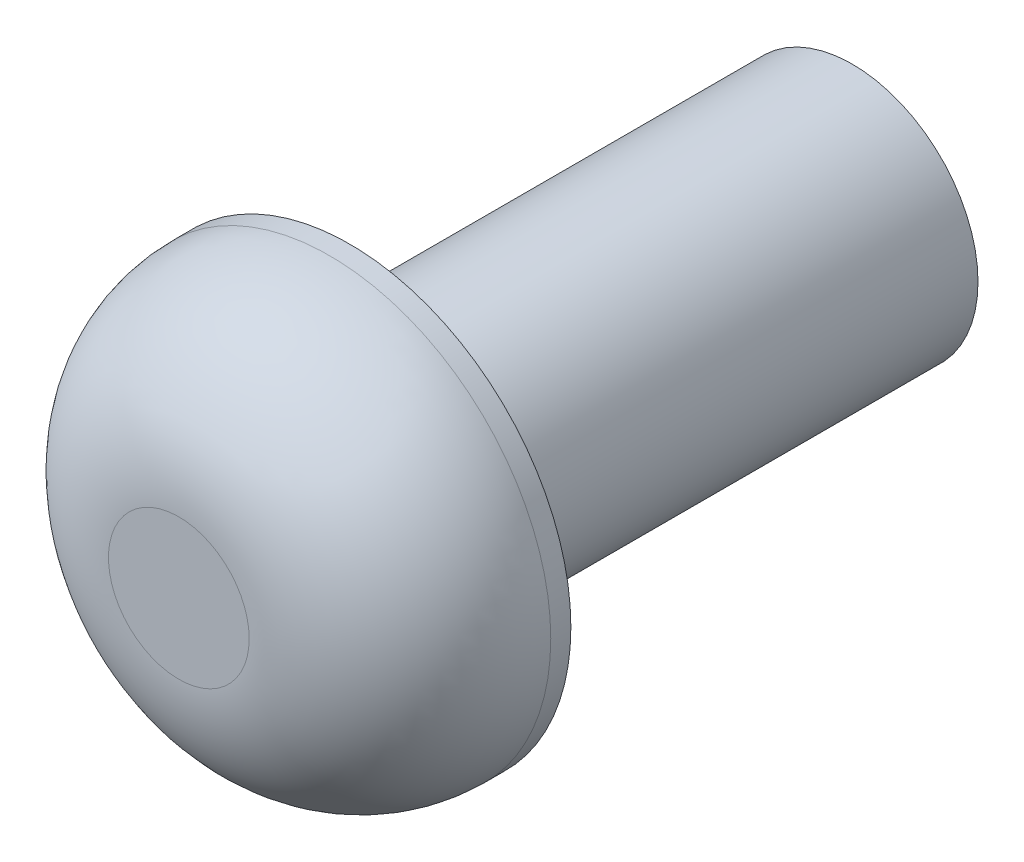
ISO-10303-21;
HEADER;
FILE_DESCRIPTION(('STEP AP214'),'2;1');
FILE_NAME('part.step','',(''),(''),'','','');
FILE_SCHEMA(('AUTOMOTIVE_DESIGN { 1 0 10303 214 1 1 1 1 }'));
ENDSEC;
DATA;
#1=APPLICATION_CONTEXT('core data for automotive mechanical design processes');
#2=APPLICATION_PROTOCOL_DEFINITION('international standard','automotive_design',2000,#1);
#3=PRODUCT_CONTEXT('',#1,'mechanical');
#4=PRODUCT('Part','Part','',(#3));
#5=PRODUCT_RELATED_PRODUCT_CATEGORY('part','',(#4));
#6=PRODUCT_DEFINITION_FORMATION('','',#4);
#7=PRODUCT_DEFINITION_CONTEXT('part definition',#1,'design');
#8=PRODUCT_DEFINITION('design','',#6,#7);
#9=PRODUCT_DEFINITION_SHAPE('','',#8);
#10=(LENGTH_UNIT() NAMED_UNIT(*) SI_UNIT(.MILLI.,.METRE.));
#11=(NAMED_UNIT(*) PLANE_ANGLE_UNIT() SI_UNIT($,.RADIAN.));
#12=(NAMED_UNIT(*) SI_UNIT($,.STERADIAN.) SOLID_ANGLE_UNIT());
#13=UNCERTAINTY_MEASURE_WITH_UNIT(LENGTH_MEASURE(1.E-05),#10,'distance_accuracy_value','');
#14=(GEOMETRIC_REPRESENTATION_CONTEXT(3) GLOBAL_UNCERTAINTY_ASSIGNED_CONTEXT((#13)) GLOBAL_UNIT_ASSIGNED_CONTEXT((#10,
#11,#12)) REPRESENTATION_CONTEXT('',''));
#15=CARTESIAN_POINT('',(0.,0.,0.));
#16=DIRECTION('',(0.,0.,1.));
#17=DIRECTION('',(1.,0.,0.));
#18=AXIS2_PLACEMENT_3D('',#15,#16,#17);
#19=CARTESIAN_POINT('',(0.,0.,10.));
#20=DIRECTION('',(0.,0.,-1.));
#21=DIRECTION('',(-1.,0.,0.));
#22=AXIS2_PLACEMENT_3D('',#19,#20,#21);
#23=CYLINDRICAL_SURFACE('',#22,2.5);
#24=CARTESIAN_POINT('',(0.,0.,10.));
#25=DIRECTION('',(0.,0.,1.));
#26=DIRECTION('',(1.,0.,0.));
#27=AXIS2_PLACEMENT_3D('',#24,#25,#26);
#28=CIRCLE('',#27,2.5);
#29=CARTESIAN_POINT('',(2.5,0.,10.));
#30=VERTEX_POINT('',#29);
#31=EDGE_CURVE('E50',#30,#30,#28,.T.);
#32=ORIENTED_EDGE('',*,*,#31,.F.);
#33=EDGE_LOOP('',(#32));
#34=FACE_BOUND('',#33,.T.);
#35=CARTESIAN_POINT('',(0.,0.,0.));
#36=DIRECTION('',(0.,0.,1.));
#37=DIRECTION('',(1.,0.,0.));
#38=AXIS2_PLACEMENT_3D('',#35,#36,#37);
#39=CIRCLE('',#38,2.5);
#40=CARTESIAN_POINT('',(2.5,0.,0.));
#41=VERTEX_POINT('',#40);
#42=EDGE_CURVE('E55',#41,#41,#39,.T.);
#43=ORIENTED_EDGE('',*,*,#42,.T.);
#44=EDGE_LOOP('',(#43));
#45=FACE_BOUND('',#44,.T.);
#46=ADVANCED_FACE('F37',(#34,#45),#23,.T.);
#47=CARTESIAN_POINT('',(0.,0.,0.));
#48=DIRECTION('',(0.,0.,1.));
#49=DIRECTION('',(1.,0.,0.));
#50=AXIS2_PLACEMENT_3D('',#47,#48,#49);
#51=PLANE('',#50);
#52=ORIENTED_EDGE('',*,*,#42,.F.);
#53=EDGE_LOOP('',(#52));
#54=FACE_BOUND('',#53,.T.);
#55=ADVANCED_FACE('F81',(#54),#51,.F.);
#56=CARTESIAN_POINT('',(0.,0.,13.4));
#57=DIRECTION('',(0.,0.,-1.));
#58=DIRECTION('',(-1.,0.,0.));
#59=AXIS2_PLACEMENT_3D('',#56,#57,#58);
#60=CYLINDRICAL_SURFACE('',#59,4.4);
#61=CARTESIAN_POINT('',(0.,0.,10.4));
#62=DIRECTION('',(0.,0.,1.));
#63=DIRECTION('',(1.,0.,0.));
#64=AXIS2_PLACEMENT_3D('',#61,#62,#63);
#65=CIRCLE('',#64,4.4);
#66=CARTESIAN_POINT('',(4.4,0.,10.4));
#67=VERTEX_POINT('',#66);
#68=EDGE_CURVE('E10',#67,#67,#65,.F.);
#69=ORIENTED_EDGE('',*,*,#68,.T.);
#70=EDGE_LOOP('',(#69));
#71=FACE_BOUND('',#70,.T.);
#72=CARTESIAN_POINT('',(0.,0.,10.));
#73=DIRECTION('',(0.,0.,1.));
#74=DIRECTION('',(1.,0.,0.));
#75=AXIS2_PLACEMENT_3D('',#72,#73,#74);
#76=CIRCLE('',#75,4.4);
#77=CARTESIAN_POINT('',(4.4,0.,10.));
#78=VERTEX_POINT('',#77);
#79=EDGE_CURVE('E60',#78,#78,#76,.T.);
#80=ORIENTED_EDGE('',*,*,#79,.T.);
#81=EDGE_LOOP('',(#80));
#82=FACE_BOUND('',#81,.T.);
#83=ADVANCED_FACE('F66',(#71,#82),#60,.T.);
#84=CARTESIAN_POINT('',(0.,0.,13.4));
#85=DIRECTION('',(0.,0.,1.));
#86=DIRECTION('',(1.,0.,0.));
#87=AXIS2_PLACEMENT_3D('',#84,#85,#86);
#88=PLANE('',#87);
#89=CARTESIAN_POINT('',(0.,0.,13.4));
#90=DIRECTION('',(0.,0.,1.));
#91=DIRECTION('',(1.,0.,0.));
#92=AXIS2_PLACEMENT_3D('',#89,#90,#91);
#93=CIRCLE('',#92,1.4);
#94=CARTESIAN_POINT('',(1.4,0.,13.4));
#95=VERTEX_POINT('',#94);
#96=EDGE_CURVE('E45',#95,#95,#93,.T.);
#97=ORIENTED_EDGE('',*,*,#96,.T.);
#98=EDGE_LOOP('',(#97));
#99=FACE_BOUND('',#98,.T.);
#100=ADVANCED_FACE('F70',(#99),#88,.T.);
#101=CARTESIAN_POINT('',(0.,0.,10.));
#102=DIRECTION('',(0.,0.,1.));
#103=DIRECTION('',(1.,0.,0.));
#104=AXIS2_PLACEMENT_3D('',#101,#102,#103);
#105=PLANE('',#104);
#106=ORIENTED_EDGE('',*,*,#31,.T.);
#107=EDGE_LOOP('',(#106));
#108=FACE_BOUND('',#107,.T.);
#109=ORIENTED_EDGE('',*,*,#79,.F.);
#110=EDGE_LOOP('',(#109));
#111=FACE_BOUND('',#110,.T.);
#112=ADVANCED_FACE('F68',(#108,#111),#105,.F.);
#113=CARTESIAN_POINT('',(0.,0.,10.4));
#114=DIRECTION('',(0.,0.,1.));
#115=DIRECTION('',(1.,0.,0.));
#116=AXIS2_PLACEMENT_3D('',#113,#114,#115);
#117=DEGENERATE_TOROIDAL_SURFACE('',#116,1.4,3.,.T.);
#118=ORIENTED_EDGE('',*,*,#68,.F.);
#119=EDGE_LOOP('',(#118));
#120=FACE_BOUND('',#119,.T.);
#121=ORIENTED_EDGE('',*,*,#96,.F.);
#122=EDGE_LOOP('',(#121));
#123=FACE_BOUND('',#122,.T.);
#124=ADVANCED_FACE('F39',(#120,#123),#117,.T.);
#125=CLOSED_SHELL('',(#46,#55,#83,#100,#112,#124));
#126=MANIFOLD_SOLID_BREP('B2',#125);
#127=ADVANCED_BREP_SHAPE_REPRESENTATION('',(#18,#126),#14);
#128=SHAPE_DEFINITION_REPRESENTATION(#9,#127);
ENDSEC;
END-ISO-10303-21;
